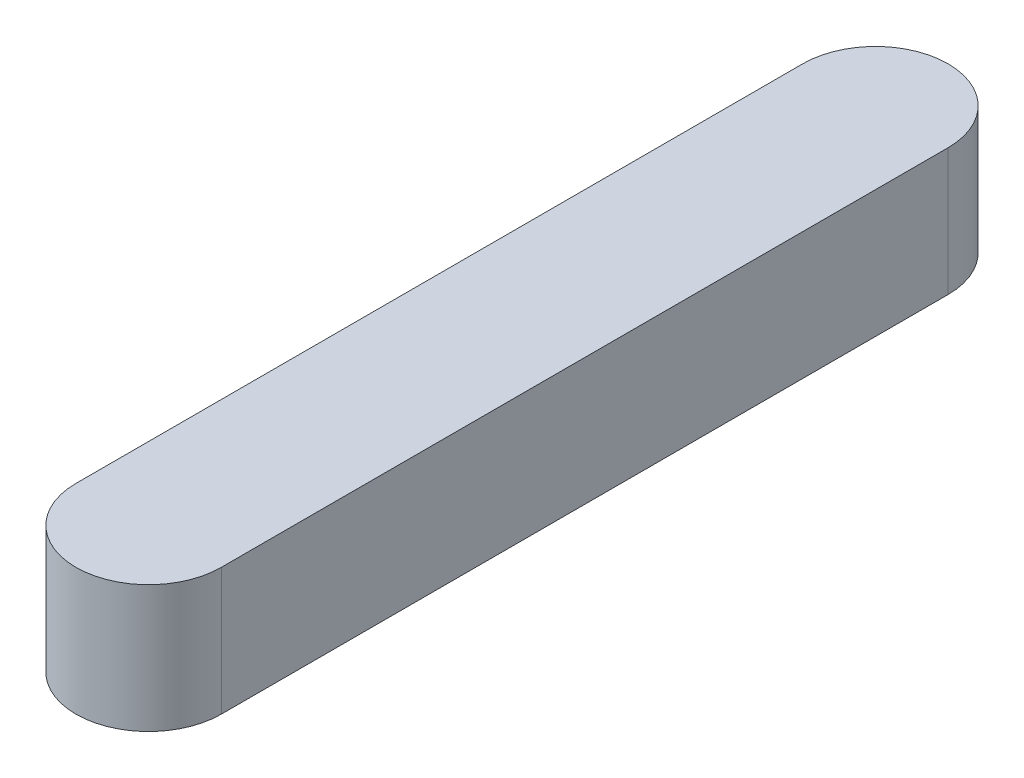
ISO-10303-21;
HEADER;
FILE_DESCRIPTION(('STEP AP214'),'2;1');
FILE_NAME('part.step','',(''),(''),'','','');
FILE_SCHEMA(('AUTOMOTIVE_DESIGN { 1 0 10303 214 1 1 1 1 }'));
ENDSEC;
DATA;
#1=APPLICATION_CONTEXT('core data for automotive mechanical design processes');
#2=APPLICATION_PROTOCOL_DEFINITION('international standard','automotive_design',2000,#1);
#3=PRODUCT_CONTEXT('',#1,'mechanical');
#4=PRODUCT('Part','Part','',(#3));
#5=PRODUCT_RELATED_PRODUCT_CATEGORY('part','',(#4));
#6=PRODUCT_DEFINITION_FORMATION('','',#4);
#7=PRODUCT_DEFINITION_CONTEXT('part definition',#1,'design');
#8=PRODUCT_DEFINITION('design','',#6,#7);
#9=PRODUCT_DEFINITION_SHAPE('','',#8);
#10=(LENGTH_UNIT() NAMED_UNIT(*) SI_UNIT(.MILLI.,.METRE.));
#11=(NAMED_UNIT(*) PLANE_ANGLE_UNIT() SI_UNIT($,.RADIAN.));
#12=(NAMED_UNIT(*) SI_UNIT($,.STERADIAN.) SOLID_ANGLE_UNIT());
#13=UNCERTAINTY_MEASURE_WITH_UNIT(LENGTH_MEASURE(1.E-05),#10,'distance_accuracy_value','');
#14=(GEOMETRIC_REPRESENTATION_CONTEXT(3) GLOBAL_UNCERTAINTY_ASSIGNED_CONTEXT((#13)) GLOBAL_UNIT_ASSIGNED_CONTEXT((#10,
#11,#12)) REPRESENTATION_CONTEXT('',''));
#15=CARTESIAN_POINT('',(0.,0.,0.));
#16=DIRECTION('',(0.,0.,1.));
#17=DIRECTION('',(1.,0.,0.));
#18=AXIS2_PLACEMENT_3D('',#15,#16,#17);
#19=CARTESIAN_POINT('',(0.,3.5,-20.));
#20=DIRECTION('',(0.,-1.,0.));
#21=DIRECTION('',(0.,0.,-1.));
#22=AXIS2_PLACEMENT_3D('',#19,#20,#21);
#23=CYLINDRICAL_SURFACE('',#22,4.);
#24=CARTESIAN_POINT('',(0.,-3.5,-20.));
#25=DIRECTION('',(0.,1.,0.));
#26=DIRECTION('',(0.,0.,1.));
#27=AXIS2_PLACEMENT_3D('',#24,#25,#26);
#28=CIRCLE('',#27,4.);
#29=CARTESIAN_POINT('',(4.,-3.5,-20.));
#30=VERTEX_POINT('',#29);
#31=CARTESIAN_POINT('',(-4.,-3.5,-20.));
#32=VERTEX_POINT('',#31);
#33=EDGE_CURVE('E102',#30,#32,#28,.T.);
#34=ORIENTED_EDGE('',*,*,#33,.T.);
#35=DIRECTION('',(0.,-1.,0.));
#36=VECTOR('',#35,1.);
#37=CARTESIAN_POINT('',(-4.,3.5,-20.));
#38=LINE('',#37,#36);
#39=CARTESIAN_POINT('',(-4.,3.5,-20.));
#40=VERTEX_POINT('',#39);
#41=EDGE_CURVE('E11',#40,#32,#38,.T.);
#42=ORIENTED_EDGE('',*,*,#41,.F.);
#43=CARTESIAN_POINT('',(0.,3.5,-20.));
#44=DIRECTION('',(0.,1.,0.));
#45=DIRECTION('',(0.,0.,1.));
#46=AXIS2_PLACEMENT_3D('',#43,#44,#45);
#47=CIRCLE('',#46,4.);
#48=CARTESIAN_POINT('',(4.,3.5,-20.));
#49=VERTEX_POINT('',#48);
#50=EDGE_CURVE('E90',#49,#40,#47,.T.);
#51=ORIENTED_EDGE('',*,*,#50,.F.);
#52=DIRECTION('',(0.,-1.,0.));
#53=VECTOR('',#52,1.);
#54=CARTESIAN_POINT('',(4.,3.5,-20.));
#55=LINE('',#54,#53);
#56=EDGE_CURVE('E98',#49,#30,#55,.T.);
#57=ORIENTED_EDGE('',*,*,#56,.T.);
#58=EDGE_LOOP('',(#34,#42,#51,#57));
#59=FACE_BOUND('',#58,.T.);
#60=ADVANCED_FACE('F39',(#59),#23,.T.);
#61=CARTESIAN_POINT('',(-4.,3.5,-20.));
#62=DIRECTION('',(1.,0.,0.));
#63=DIRECTION('',(0.,0.,-1.));
#64=AXIS2_PLACEMENT_3D('',#61,#62,#63);
#65=PLANE('',#64);
#66=DIRECTION('',(0.,0.,1.));
#67=VECTOR('',#66,1.);
#68=CARTESIAN_POINT('',(-4.,-3.5,-20.));
#69=LINE('',#68,#67);
#70=CARTESIAN_POINT('',(-4.,-3.5,20.));
#71=VERTEX_POINT('',#70);
#72=EDGE_CURVE('E94',#32,#71,#69,.T.);
#73=ORIENTED_EDGE('',*,*,#72,.T.);
#74=DIRECTION('',(0.,-1.,0.));
#75=VECTOR('',#74,1.);
#76=CARTESIAN_POINT('',(-4.,3.5,20.));
#77=LINE('',#76,#75);
#78=CARTESIAN_POINT('',(-4.,3.5,20.));
#79=VERTEX_POINT('',#78);
#80=EDGE_CURVE('E47',#79,#71,#77,.T.);
#81=ORIENTED_EDGE('',*,*,#80,.F.);
#82=DIRECTION('',(0.,0.,1.));
#83=VECTOR('',#82,1.);
#84=CARTESIAN_POINT('',(-4.,3.5,-20.));
#85=LINE('',#84,#83);
#86=EDGE_CURVE('E85',#40,#79,#85,.T.);
#87=ORIENTED_EDGE('',*,*,#86,.F.);
#88=ORIENTED_EDGE('',*,*,#41,.T.);
#89=EDGE_LOOP('',(#73,#81,#87,#88));
#90=FACE_BOUND('',#89,.T.);
#91=ADVANCED_FACE('F93',(#90),#65,.F.);
#92=CARTESIAN_POINT('',(0.,3.5,20.));
#93=DIRECTION('',(0.,-1.,0.));
#94=DIRECTION('',(0.,0.,-1.));
#95=AXIS2_PLACEMENT_3D('',#92,#93,#94);
#96=CYLINDRICAL_SURFACE('',#95,4.);
#97=CARTESIAN_POINT('',(0.,-3.5,20.));
#98=DIRECTION('',(0.,1.,0.));
#99=DIRECTION('',(0.,0.,1.));
#100=AXIS2_PLACEMENT_3D('',#97,#98,#99);
#101=CIRCLE('',#100,4.);
#102=CARTESIAN_POINT('',(4.,-3.5,20.));
#103=VERTEX_POINT('',#102);
#104=EDGE_CURVE('E72',#71,#103,#101,.T.);
#105=ORIENTED_EDGE('',*,*,#104,.T.);
#106=DIRECTION('',(0.,-1.,0.));
#107=VECTOR('',#106,1.);
#108=CARTESIAN_POINT('',(4.,3.5,20.));
#109=LINE('',#108,#107);
#110=CARTESIAN_POINT('',(4.,3.5,20.));
#111=VERTEX_POINT('',#110);
#112=EDGE_CURVE('E95',#111,#103,#109,.T.);
#113=ORIENTED_EDGE('',*,*,#112,.F.);
#114=CARTESIAN_POINT('',(0.,3.5,20.));
#115=DIRECTION('',(0.,1.,0.));
#116=DIRECTION('',(0.,0.,1.));
#117=AXIS2_PLACEMENT_3D('',#114,#115,#116);
#118=CIRCLE('',#117,4.);
#119=EDGE_CURVE('E88',#79,#111,#118,.T.);
#120=ORIENTED_EDGE('',*,*,#119,.F.);
#121=ORIENTED_EDGE('',*,*,#80,.T.);
#122=EDGE_LOOP('',(#105,#113,#120,#121));
#123=FACE_BOUND('',#122,.T.);
#124=ADVANCED_FACE('F96',(#123),#96,.T.);
#125=CARTESIAN_POINT('',(4.,3.5,-20.));
#126=DIRECTION('',(-1.,0.,0.));
#127=DIRECTION('',(0.,0.,1.));
#128=AXIS2_PLACEMENT_3D('',#125,#126,#127);
#129=PLANE('',#128);
#130=DIRECTION('',(0.,0.,-1.));
#131=VECTOR('',#130,1.);
#132=CARTESIAN_POINT('',(4.,-3.5,-20.));
#133=LINE('',#132,#131);
#134=EDGE_CURVE('E78',#103,#30,#133,.T.);
#135=ORIENTED_EDGE('',*,*,#134,.T.);
#136=ORIENTED_EDGE('',*,*,#56,.F.);
#137=DIRECTION('',(0.,0.,-1.));
#138=VECTOR('',#137,1.);
#139=CARTESIAN_POINT('',(4.,3.5,-20.));
#140=LINE('',#139,#138);
#141=EDGE_CURVE('E55',#111,#49,#140,.T.);
#142=ORIENTED_EDGE('',*,*,#141,.F.);
#143=ORIENTED_EDGE('',*,*,#112,.T.);
#144=EDGE_LOOP('',(#135,#136,#142,#143));
#145=FACE_BOUND('',#144,.T.);
#146=ADVANCED_FACE('F109',(#145),#129,.F.);
#147=CARTESIAN_POINT('',(0.,3.5,-20.));
#148=DIRECTION('',(0.,1.,0.));
#149=DIRECTION('',(0.,0.,1.));
#150=AXIS2_PLACEMENT_3D('',#147,#148,#149);
#151=PLANE('',#150);
#152=ORIENTED_EDGE('',*,*,#50,.T.);
#153=ORIENTED_EDGE('',*,*,#86,.T.);
#154=ORIENTED_EDGE('',*,*,#119,.T.);
#155=ORIENTED_EDGE('',*,*,#141,.T.);
#156=EDGE_LOOP('',(#152,#153,#154,#155));
#157=FACE_BOUND('',#156,.T.);
#158=ADVANCED_FACE('F86',(#157),#151,.T.);
#159=CARTESIAN_POINT('',(0.,-3.5,-20.));
#160=DIRECTION('',(0.,1.,0.));
#161=DIRECTION('',(0.,0.,1.));
#162=AXIS2_PLACEMENT_3D('',#159,#160,#161);
#163=PLANE('',#162);
#164=ORIENTED_EDGE('',*,*,#33,.F.);
#165=ORIENTED_EDGE('',*,*,#134,.F.);
#166=ORIENTED_EDGE('',*,*,#104,.F.);
#167=ORIENTED_EDGE('',*,*,#72,.F.);
#168=EDGE_LOOP('',(#164,#165,#166,#167));
#169=FACE_BOUND('',#168,.T.);
#170=ADVANCED_FACE('F112',(#169),#163,.F.);
#171=CLOSED_SHELL('',(#60,#91,#124,#146,#158,#170));
#172=MANIFOLD_SOLID_BREP('B2',#171);
#173=ADVANCED_BREP_SHAPE_REPRESENTATION('',(#18,#172),#14);
#174=SHAPE_DEFINITION_REPRESENTATION(#9,#173);
ENDSEC;
END-ISO-10303-21;
